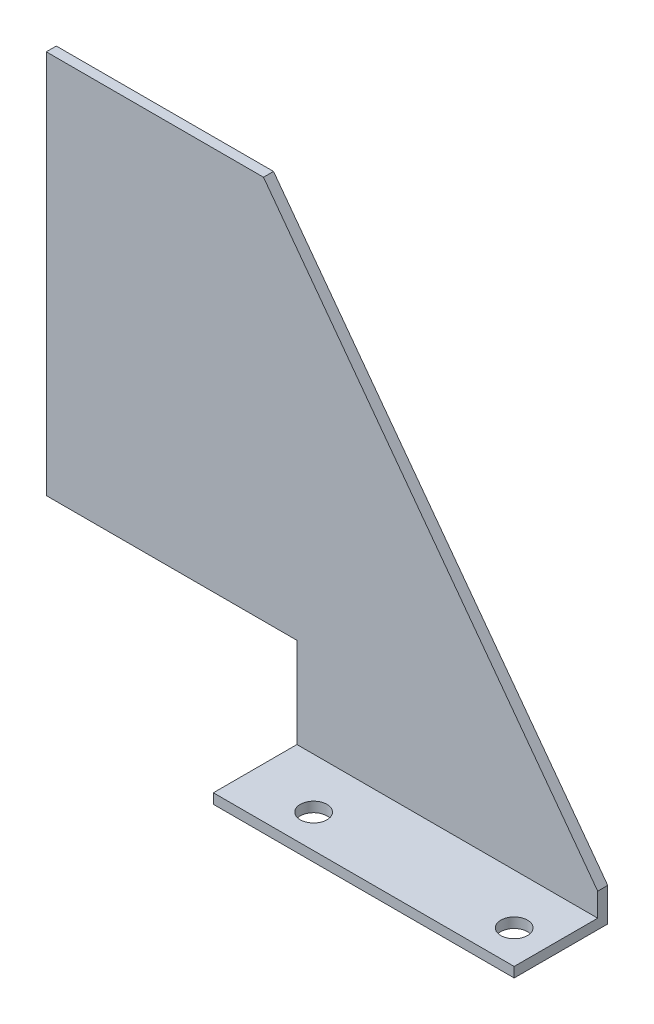
ISO-10303-21;
HEADER;
FILE_DESCRIPTION(('STEP AP214'),'2;1');
FILE_NAME('part.step','',(''),(''),'','','');
FILE_SCHEMA(('AUTOMOTIVE_DESIGN { 1 0 10303 214 1 1 1 1 }'));
ENDSEC;
DATA;
#1=APPLICATION_CONTEXT('core data for automotive mechanical design processes');
#2=APPLICATION_PROTOCOL_DEFINITION('international standard','automotive_design',2000,#1);
#3=PRODUCT_CONTEXT('',#1,'mechanical');
#4=PRODUCT('Part','Part','',(#3));
#5=PRODUCT_RELATED_PRODUCT_CATEGORY('part','',(#4));
#6=PRODUCT_DEFINITION_FORMATION('','',#4);
#7=PRODUCT_DEFINITION_CONTEXT('part definition',#1,'design');
#8=PRODUCT_DEFINITION('design','',#6,#7);
#9=PRODUCT_DEFINITION_SHAPE('','',#8);
#10=(LENGTH_UNIT() NAMED_UNIT(*) SI_UNIT(.MILLI.,.METRE.));
#11=(NAMED_UNIT(*) PLANE_ANGLE_UNIT() SI_UNIT($,.RADIAN.));
#12=(NAMED_UNIT(*) SI_UNIT($,.STERADIAN.) SOLID_ANGLE_UNIT());
#13=UNCERTAINTY_MEASURE_WITH_UNIT(LENGTH_MEASURE(1.E-05),#10,'distance_accuracy_value','');
#14=(GEOMETRIC_REPRESENTATION_CONTEXT(3) GLOBAL_UNCERTAINTY_ASSIGNED_CONTEXT((#13)) GLOBAL_UNIT_ASSIGNED_CONTEXT((#10,
#11,#12)) REPRESENTATION_CONTEXT('',''));
#15=CARTESIAN_POINT('',(0.,0.,0.));
#16=DIRECTION('',(0.,0.,1.));
#17=DIRECTION('',(1.,0.,0.));
#18=AXIS2_PLACEMENT_3D('',#15,#16,#17);
#19=CARTESIAN_POINT('',(0.,12.6977591036414,3.));
#20=DIRECTION('',(0.,0.,-1.));
#21=DIRECTION('',(-1.,0.,0.));
#22=AXIS2_PLACEMENT_3D('',#19,#20,#21);
#23=PLANE('',#22);
#24=DIRECTION('',(-1.,0.,0.));
#25=VECTOR('',#24,1.);
#26=CARTESIAN_POINT('',(75.,-14.3046237830617,3.));
#27=LINE('',#26,#25);
#28=CARTESIAN_POINT('',(165.,-14.3046237830617,3.));
#29=VERTEX_POINT('',#28);
#30=CARTESIAN_POINT('',(75.,-14.3046237830617,3.));
#31=VERTEX_POINT('',#30);
#32=EDGE_CURVE('E32',#29,#31,#27,.T.);
#33=ORIENTED_EDGE('',*,*,#32,.F.);
#34=DIRECTION('',(0.,1.,0.));
#35=VECTOR('',#34,1.);
#36=CARTESIAN_POINT('',(165.,-7.30224089635853,3.));
#37=LINE('',#36,#35);
#38=CARTESIAN_POINT('',(165.,-7.30224089635853,3.));
#39=VERTEX_POINT('',#38);
#40=EDGE_CURVE('E91',#29,#39,#37,.T.);
#41=ORIENTED_EDGE('',*,*,#40,.T.);
#42=DIRECTION('',(-0.595227550625738,0.803557193344746,0.));
#43=VECTOR('',#42,1.);
#44=CARTESIAN_POINT('',(65.,127.697759103641,3.));
#45=LINE('',#44,#43);
#46=CARTESIAN_POINT('',(65.,127.697759103641,3.));
#47=VERTEX_POINT('',#46);
#48=EDGE_CURVE('E164',#39,#47,#45,.T.);
#49=ORIENTED_EDGE('',*,*,#48,.T.);
#50=DIRECTION('',(-1.,0.,0.));
#51=VECTOR('',#50,1.);
#52=CARTESIAN_POINT('',(0.,127.697759103641,3.));
#53=LINE('',#52,#51);
#54=CARTESIAN_POINT('',(0.,127.697759103641,3.));
#55=VERTEX_POINT('',#54);
#56=EDGE_CURVE('E163',#47,#55,#53,.T.);
#57=ORIENTED_EDGE('',*,*,#56,.T.);
#58=DIRECTION('',(0.,-1.,0.));
#59=VECTOR('',#58,1.);
#60=CARTESIAN_POINT('',(0.,12.6977591036414,3.));
#61=LINE('',#60,#59);
#62=CARTESIAN_POINT('',(0.,12.6977591036414,3.));
#63=VERTEX_POINT('',#62);
#64=EDGE_CURVE('E39',#55,#63,#61,.T.);
#65=ORIENTED_EDGE('',*,*,#64,.T.);
#66=DIRECTION('',(1.,0.,0.));
#67=VECTOR('',#66,1.);
#68=CARTESIAN_POINT('',(75.,12.6977591036414,3.));
#69=LINE('',#68,#67);
#70=CARTESIAN_POINT('',(75.,12.6977591036414,3.));
#71=VERTEX_POINT('',#70);
#72=EDGE_CURVE('E87',#63,#71,#69,.T.);
#73=ORIENTED_EDGE('',*,*,#72,.T.);
#74=DIRECTION('',(0.,-1.,0.));
#75=VECTOR('',#74,1.);
#76=CARTESIAN_POINT('',(75.,-17.3022408963586,3.));
#77=LINE('',#76,#75);
#78=EDGE_CURVE('E85',#71,#31,#77,.T.);
#79=ORIENTED_EDGE('',*,*,#78,.T.);
#80=EDGE_LOOP('',(#33,#41,#49,#57,#65,#73,#79));
#81=FACE_BOUND('',#80,.T.);
#82=ADVANCED_FACE('F15',(#81),#23,.F.);
#83=CARTESIAN_POINT('',(75.,12.6977591036414,3.));
#84=DIRECTION('',(0.,1.,0.));
#85=DIRECTION('',(-1.,0.,0.));
#86=AXIS2_PLACEMENT_3D('',#83,#84,#85);
#87=PLANE('',#86);
#88=DIRECTION('',(1.,0.,0.));
#89=VECTOR('',#88,1.);
#90=CARTESIAN_POINT('',(75.,12.6977591036414,0.));
#91=LINE('',#90,#89);
#92=CARTESIAN_POINT('',(0.,12.6977591036414,0.));
#93=VERTEX_POINT('',#92);
#94=CARTESIAN_POINT('',(75.,12.6977591036414,0.));
#95=VERTEX_POINT('',#94);
#96=EDGE_CURVE('E109',#93,#95,#91,.T.);
#97=ORIENTED_EDGE('',*,*,#96,.T.);
#98=DIRECTION('',(0.,0.,-1.));
#99=VECTOR('',#98,1.);
#100=CARTESIAN_POINT('',(75.,12.6977591036414,3.));
#101=LINE('',#100,#99);
#102=EDGE_CURVE('E10',#71,#95,#101,.T.);
#103=ORIENTED_EDGE('',*,*,#102,.F.);
#104=ORIENTED_EDGE('',*,*,#72,.F.);
#105=DIRECTION('',(0.,0.,-1.));
#106=VECTOR('',#105,1.);
#107=CARTESIAN_POINT('',(0.,12.6977591036414,3.));
#108=LINE('',#107,#106);
#109=EDGE_CURVE('E159',#63,#93,#108,.T.);
#110=ORIENTED_EDGE('',*,*,#109,.T.);
#111=EDGE_LOOP('',(#97,#103,#104,#110));
#112=FACE_BOUND('',#111,.T.);
#113=ADVANCED_FACE('F17',(#112),#87,.F.);
#114=CARTESIAN_POINT('',(75.,-17.3022408963586,3.));
#115=DIRECTION('',(1.,0.,0.));
#116=DIRECTION('',(0.,1.,0.));
#117=AXIS2_PLACEMENT_3D('',#114,#115,#116);
#118=PLANE('',#117);
#119=DIRECTION('',(0.,-1.,0.));
#120=VECTOR('',#119,1.);
#121=CARTESIAN_POINT('',(75.,-17.3022408963586,0.));
#122=LINE('',#121,#120);
#123=CARTESIAN_POINT('',(75.,-17.3022408963586,0.));
#124=VERTEX_POINT('',#123);
#125=EDGE_CURVE('E128',#95,#124,#122,.T.);
#126=ORIENTED_EDGE('',*,*,#125,.T.);
#127=DIRECTION('',(0.,0.,-1.));
#128=VECTOR('',#127,1.);
#129=CARTESIAN_POINT('',(75.,-17.3022408963586,3.));
#130=LINE('',#129,#128);
#131=CARTESIAN_POINT('',(75.,-17.3022408963586,28.));
#132=VERTEX_POINT('',#131);
#133=EDGE_CURVE('E24',#132,#124,#130,.T.);
#134=ORIENTED_EDGE('',*,*,#133,.F.);
#135=DIRECTION('',(0.,-1.,0.));
#136=VECTOR('',#135,1.);
#137=CARTESIAN_POINT('',(75.,-17.3022408963586,28.));
#138=LINE('',#137,#136);
#139=CARTESIAN_POINT('',(75.,-14.3046237830617,28.));
#140=VERTEX_POINT('',#139);
#141=EDGE_CURVE('E102',#140,#132,#138,.T.);
#142=ORIENTED_EDGE('',*,*,#141,.F.);
#143=DIRECTION('',(0.,0.,-1.));
#144=VECTOR('',#143,1.);
#145=CARTESIAN_POINT('',(75.,-14.3046237830617,28.));
#146=LINE('',#145,#144);
#147=EDGE_CURVE('E98',#140,#31,#146,.T.);
#148=ORIENTED_EDGE('',*,*,#147,.T.);
#149=ORIENTED_EDGE('',*,*,#78,.F.);
#150=ORIENTED_EDGE('',*,*,#102,.T.);
#151=EDGE_LOOP('',(#126,#134,#142,#148,#149,#150));
#152=FACE_BOUND('',#151,.T.);
#153=ADVANCED_FACE('F105',(#152),#118,.F.);
#154=CARTESIAN_POINT('',(165.,-17.3022408963586,3.));
#155=DIRECTION('',(0.,1.,0.));
#156=DIRECTION('',(-1.,0.,0.));
#157=AXIS2_PLACEMENT_3D('',#154,#155,#156);
#158=PLANE('',#157);
#159=CARTESIAN_POINT('',(95.,-17.3022408963586,18.));
#160=DIRECTION('',(0.,1.,0.));
#161=DIRECTION('',(-1.,0.,0.));
#162=AXIS2_PLACEMENT_3D('',#159,#160,#161);
#163=CIRCLE('',#162,4.);
#164=CARTESIAN_POINT('',(91.,-17.3022408963586,18.));
#165=VERTEX_POINT('',#164);
#166=EDGE_CURVE('E308',#165,#165,#163,.T.);
#167=ORIENTED_EDGE('',*,*,#166,.T.);
#168=EDGE_LOOP('',(#167));
#169=FACE_BOUND('',#168,.T.);
#170=CARTESIAN_POINT('',(155.,-17.3022408963586,18.));
#171=DIRECTION('',(0.,1.,0.));
#172=DIRECTION('',(-1.,0.,0.));
#173=AXIS2_PLACEMENT_3D('',#170,#171,#172);
#174=CIRCLE('',#173,4.);
#175=CARTESIAN_POINT('',(151.,-17.3022408963586,18.));
#176=VERTEX_POINT('',#175);
#177=EDGE_CURVE('E103',#176,#176,#174,.T.);
#178=ORIENTED_EDGE('',*,*,#177,.T.);
#179=EDGE_LOOP('',(#178));
#180=FACE_BOUND('',#179,.T.);
#181=DIRECTION('',(1.,0.,0.));
#182=VECTOR('',#181,1.);
#183=CARTESIAN_POINT('',(165.,-17.3022408963586,0.));
#184=LINE('',#183,#182);
#185=CARTESIAN_POINT('',(165.,-17.3022408963586,0.));
#186=VERTEX_POINT('',#185);
#187=EDGE_CURVE('E130',#124,#186,#184,.T.);
#188=ORIENTED_EDGE('',*,*,#187,.T.);
#189=DIRECTION('',(0.,0.,-1.));
#190=VECTOR('',#189,1.);
#191=CARTESIAN_POINT('',(165.,-17.3022408963586,3.));
#192=LINE('',#191,#190);
#193=CARTESIAN_POINT('',(165.,-17.3022408963586,28.));
#194=VERTEX_POINT('',#193);
#195=EDGE_CURVE('E147',#194,#186,#192,.T.);
#196=ORIENTED_EDGE('',*,*,#195,.F.);
#197=DIRECTION('',(1.,0.,0.));
#198=VECTOR('',#197,1.);
#199=CARTESIAN_POINT('',(75.,-17.3022408963586,28.));
#200=LINE('',#199,#198);
#201=EDGE_CURVE('E122',#132,#194,#200,.T.);
#202=ORIENTED_EDGE('',*,*,#201,.F.);
#203=ORIENTED_EDGE('',*,*,#133,.T.);
#204=EDGE_LOOP('',(#188,#196,#202,#203));
#205=FACE_BOUND('',#204,.T.);
#206=ADVANCED_FACE('F188',(#169,#180,#205),#158,.F.);
#207=CARTESIAN_POINT('',(165.,-7.30224089635853,3.));
#208=DIRECTION('',(-1.,0.,0.));
#209=DIRECTION('',(0.,-1.,0.));
#210=AXIS2_PLACEMENT_3D('',#207,#208,#209);
#211=PLANE('',#210);
#212=DIRECTION('',(0.,1.,0.));
#213=VECTOR('',#212,1.);
#214=CARTESIAN_POINT('',(165.,-7.30224089635853,0.));
#215=LINE('',#214,#213);
#216=CARTESIAN_POINT('',(165.,-7.30224089635853,0.));
#217=VERTEX_POINT('',#216);
#218=EDGE_CURVE('E132',#186,#217,#215,.T.);
#219=ORIENTED_EDGE('',*,*,#218,.T.);
#220=DIRECTION('',(0.,0.,-1.));
#221=VECTOR('',#220,1.);
#222=CARTESIAN_POINT('',(165.,-7.30224089635853,3.));
#223=LINE('',#222,#221);
#224=EDGE_CURVE('E150',#39,#217,#223,.T.);
#225=ORIENTED_EDGE('',*,*,#224,.F.);
#226=ORIENTED_EDGE('',*,*,#40,.F.);
#227=DIRECTION('',(0.,0.,-1.));
#228=VECTOR('',#227,1.);
#229=CARTESIAN_POINT('',(165.,-14.3046237830617,28.));
#230=LINE('',#229,#228);
#231=CARTESIAN_POINT('',(165.,-14.3046237830617,28.));
#232=VERTEX_POINT('',#231);
#233=EDGE_CURVE('E101',#232,#29,#230,.T.);
#234=ORIENTED_EDGE('',*,*,#233,.F.);
#235=DIRECTION('',(0.,1.,0.));
#236=VECTOR('',#235,1.);
#237=CARTESIAN_POINT('',(165.,-14.3046237830617,28.));
#238=LINE('',#237,#236);
#239=EDGE_CURVE('E110',#194,#232,#238,.T.);
#240=ORIENTED_EDGE('',*,*,#239,.F.);
#241=ORIENTED_EDGE('',*,*,#195,.T.);
#242=EDGE_LOOP('',(#219,#225,#226,#234,#240,#241));
#243=FACE_BOUND('',#242,.T.);
#244=ADVANCED_FACE('F169',(#243),#211,.F.);
#245=CARTESIAN_POINT('',(65.,127.697759103641,3.));
#246=DIRECTION('',(-0.803557193344745,-0.595227550625738,0.));
#247=DIRECTION('',(0.595227550625738,-0.803557193344746,0.));
#248=AXIS2_PLACEMENT_3D('',#245,#246,#247);
#249=PLANE('',#248);
#250=DIRECTION('',(-0.595227550625738,0.803557193344746,0.));
#251=VECTOR('',#250,1.);
#252=CARTESIAN_POINT('',(65.,127.697759103641,0.));
#253=LINE('',#252,#251);
#254=CARTESIAN_POINT('',(65.,127.697759103641,0.));
#255=VERTEX_POINT('',#254);
#256=EDGE_CURVE('E134',#217,#255,#253,.T.);
#257=ORIENTED_EDGE('',*,*,#256,.T.);
#258=DIRECTION('',(0.,0.,-1.));
#259=VECTOR('',#258,1.);
#260=CARTESIAN_POINT('',(65.,127.697759103641,3.));
#261=LINE('',#260,#259);
#262=EDGE_CURVE('E153',#47,#255,#261,.T.);
#263=ORIENTED_EDGE('',*,*,#262,.F.);
#264=ORIENTED_EDGE('',*,*,#48,.F.);
#265=ORIENTED_EDGE('',*,*,#224,.T.);
#266=EDGE_LOOP('',(#257,#263,#264,#265));
#267=FACE_BOUND('',#266,.T.);
#268=ADVANCED_FACE('F173',(#267),#249,.F.);
#269=CARTESIAN_POINT('',(0.,127.697759103641,3.));
#270=DIRECTION('',(0.,-1.,0.));
#271=DIRECTION('',(1.,0.,0.));
#272=AXIS2_PLACEMENT_3D('',#269,#270,#271);
#273=PLANE('',#272);
#274=DIRECTION('',(-1.,0.,0.));
#275=VECTOR('',#274,1.);
#276=CARTESIAN_POINT('',(0.,127.697759103641,0.));
#277=LINE('',#276,#275);
#278=CARTESIAN_POINT('',(0.,127.697759103641,0.));
#279=VERTEX_POINT('',#278);
#280=EDGE_CURVE('E136',#255,#279,#277,.T.);
#281=ORIENTED_EDGE('',*,*,#280,.T.);
#282=DIRECTION('',(0.,0.,-1.));
#283=VECTOR('',#282,1.);
#284=CARTESIAN_POINT('',(0.,127.697759103641,3.));
#285=LINE('',#284,#283);
#286=EDGE_CURVE('E156',#55,#279,#285,.T.);
#287=ORIENTED_EDGE('',*,*,#286,.F.);
#288=ORIENTED_EDGE('',*,*,#56,.F.);
#289=ORIENTED_EDGE('',*,*,#262,.T.);
#290=EDGE_LOOP('',(#281,#287,#288,#289));
#291=FACE_BOUND('',#290,.T.);
#292=ADVANCED_FACE('F178',(#291),#273,.F.);
#293=CARTESIAN_POINT('',(0.,12.6977591036414,3.));
#294=DIRECTION('',(1.,0.,0.));
#295=DIRECTION('',(0.,0.,-1.));
#296=AXIS2_PLACEMENT_3D('',#293,#294,#295);
#297=PLANE('',#296);
#298=DIRECTION('',(0.,-1.,0.));
#299=VECTOR('',#298,1.);
#300=CARTESIAN_POINT('',(0.,12.6977591036414,0.));
#301=LINE('',#300,#299);
#302=EDGE_CURVE('E138',#279,#93,#301,.T.);
#303=ORIENTED_EDGE('',*,*,#302,.T.);
#304=ORIENTED_EDGE('',*,*,#109,.F.);
#305=ORIENTED_EDGE('',*,*,#64,.F.);
#306=ORIENTED_EDGE('',*,*,#286,.T.);
#307=EDGE_LOOP('',(#303,#304,#305,#306));
#308=FACE_BOUND('',#307,.T.);
#309=ADVANCED_FACE('F181',(#308),#297,.F.);
#310=CARTESIAN_POINT('',(0.,12.6977591036414,0.));
#311=DIRECTION('',(0.,0.,-1.));
#312=DIRECTION('',(-1.,0.,0.));
#313=AXIS2_PLACEMENT_3D('',#310,#311,#312);
#314=PLANE('',#313);
#315=ORIENTED_EDGE('',*,*,#96,.F.);
#316=ORIENTED_EDGE('',*,*,#302,.F.);
#317=ORIENTED_EDGE('',*,*,#280,.F.);
#318=ORIENTED_EDGE('',*,*,#256,.F.);
#319=ORIENTED_EDGE('',*,*,#218,.F.);
#320=ORIENTED_EDGE('',*,*,#187,.F.);
#321=ORIENTED_EDGE('',*,*,#125,.F.);
#322=EDGE_LOOP('',(#315,#316,#317,#318,#319,#320,#321));
#323=FACE_BOUND('',#322,.T.);
#324=ADVANCED_FACE('F189',(#323),#314,.T.);
#325=CARTESIAN_POINT('',(75.,-14.3046237830617,28.));
#326=DIRECTION('',(0.,-1.,0.));
#327=DIRECTION('',(0.,0.,-1.));
#328=AXIS2_PLACEMENT_3D('',#325,#326,#327);
#329=PLANE('',#328);
#330=CARTESIAN_POINT('',(95.,-14.3046237830617,18.));
#331=DIRECTION('',(0.,1.,0.));
#332=DIRECTION('',(0.,0.,1.));
#333=AXIS2_PLACEMENT_3D('',#330,#331,#332);
#334=CIRCLE('',#333,4.);
#335=CARTESIAN_POINT('',(95.,-14.3046237830617,22.));
#336=VERTEX_POINT('',#335);
#337=EDGE_CURVE('E305',#336,#336,#334,.T.);
#338=ORIENTED_EDGE('',*,*,#337,.F.);
#339=EDGE_LOOP('',(#338));
#340=FACE_BOUND('',#339,.T.);
#341=CARTESIAN_POINT('',(155.,-14.3046237830617,18.));
#342=DIRECTION('',(0.,1.,0.));
#343=DIRECTION('',(0.,0.,1.));
#344=AXIS2_PLACEMENT_3D('',#341,#342,#343);
#345=CIRCLE('',#344,4.);
#346=CARTESIAN_POINT('',(155.,-14.3046237830617,22.));
#347=VERTEX_POINT('',#346);
#348=EDGE_CURVE('E309',#347,#347,#345,.T.);
#349=ORIENTED_EDGE('',*,*,#348,.F.);
#350=EDGE_LOOP('',(#349));
#351=FACE_BOUND('',#350,.T.);
#352=ORIENTED_EDGE('',*,*,#32,.T.);
#353=ORIENTED_EDGE('',*,*,#147,.F.);
#354=DIRECTION('',(-1.,0.,0.));
#355=VECTOR('',#354,1.);
#356=CARTESIAN_POINT('',(75.,-14.3046237830617,28.));
#357=LINE('',#356,#355);
#358=EDGE_CURVE('E107',#232,#140,#357,.T.);
#359=ORIENTED_EDGE('',*,*,#358,.F.);
#360=ORIENTED_EDGE('',*,*,#233,.T.);
#361=EDGE_LOOP('',(#352,#353,#359,#360));
#362=FACE_BOUND('',#361,.T.);
#363=ADVANCED_FACE('F96',(#340,#351,#362),#329,.F.);
#364=CARTESIAN_POINT('',(75.,-14.3046237830617,28.));
#365=DIRECTION('',(0.,0.,-1.));
#366=DIRECTION('',(-1.,0.,0.));
#367=AXIS2_PLACEMENT_3D('',#364,#365,#366);
#368=PLANE('',#367);
#369=ORIENTED_EDGE('',*,*,#141,.T.);
#370=ORIENTED_EDGE('',*,*,#201,.T.);
#371=ORIENTED_EDGE('',*,*,#239,.T.);
#372=ORIENTED_EDGE('',*,*,#358,.T.);
#373=EDGE_LOOP('',(#369,#370,#371,#372));
#374=FACE_BOUND('',#373,.T.);
#375=ADVANCED_FACE('F197',(#374),#368,.F.);
#376=CARTESIAN_POINT('',(155.,-19.3046237830617,18.));
#377=DIRECTION('',(0.,1.,0.));
#378=DIRECTION('',(0.,0.,1.));
#379=AXIS2_PLACEMENT_3D('',#376,#377,#378);
#380=CYLINDRICAL_SURFACE('',#379,4.);
#381=ORIENTED_EDGE('',*,*,#348,.T.);
#382=EDGE_LOOP('',(#381));
#383=FACE_BOUND('',#382,.T.);
#384=ORIENTED_EDGE('',*,*,#177,.F.);
#385=EDGE_LOOP('',(#384));
#386=FACE_BOUND('',#385,.T.);
#387=ADVANCED_FACE('F278',(#383,#386),#380,.F.);
#388=CARTESIAN_POINT('',(95.,-19.3046237830617,18.));
#389=DIRECTION('',(0.,1.,0.));
#390=DIRECTION('',(0.,0.,1.));
#391=AXIS2_PLACEMENT_3D('',#388,#389,#390);
#392=CYLINDRICAL_SURFACE('',#391,4.);
#393=ORIENTED_EDGE('',*,*,#337,.T.);
#394=EDGE_LOOP('',(#393));
#395=FACE_BOUND('',#394,.T.);
#396=ORIENTED_EDGE('',*,*,#166,.F.);
#397=EDGE_LOOP('',(#396));
#398=FACE_BOUND('',#397,.T.);
#399=ADVANCED_FACE('F287',(#395,#398),#392,.F.);
#400=CLOSED_SHELL('',(#82,#113,#153,#206,#244,#268,#292,#309,#324,#363,#375,#387,#399));
#401=MANIFOLD_SOLID_BREP('B1',#400);
#402=ADVANCED_BREP_SHAPE_REPRESENTATION('',(#18,#401),#14);
#403=SHAPE_DEFINITION_REPRESENTATION(#9,#402);
ENDSEC;
END-ISO-10303-21;
